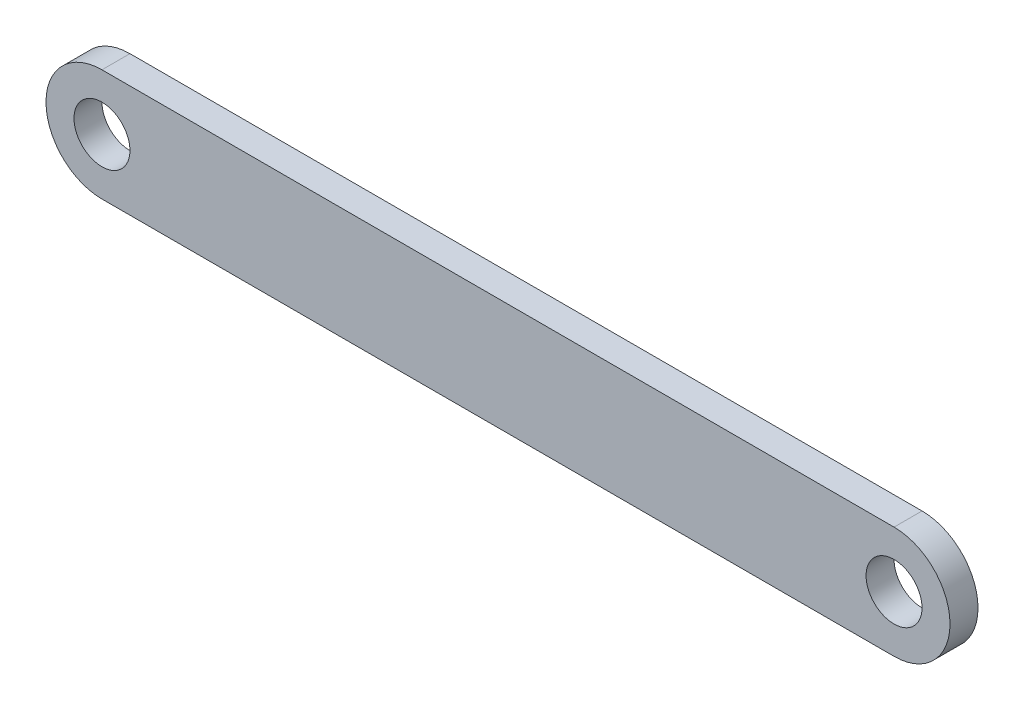
ISO-10303-21;
HEADER;
FILE_DESCRIPTION(('STEP AP214'),'2;1');
FILE_NAME('part.step','',(''),(''),'','','');
FILE_SCHEMA(('AUTOMOTIVE_DESIGN { 1 0 10303 214 1 1 1 1 }'));
ENDSEC;
DATA;
#1=APPLICATION_CONTEXT('core data for automotive mechanical design processes');
#2=APPLICATION_PROTOCOL_DEFINITION('international standard','automotive_design',2000,#1);
#3=PRODUCT_CONTEXT('',#1,'mechanical');
#4=PRODUCT('Part','Part','',(#3));
#5=PRODUCT_RELATED_PRODUCT_CATEGORY('part','',(#4));
#6=PRODUCT_DEFINITION_FORMATION('','',#4);
#7=PRODUCT_DEFINITION_CONTEXT('part definition',#1,'design');
#8=PRODUCT_DEFINITION('design','',#6,#7);
#9=PRODUCT_DEFINITION_SHAPE('','',#8);
#10=(LENGTH_UNIT() NAMED_UNIT(*) SI_UNIT(.MILLI.,.METRE.));
#11=(NAMED_UNIT(*) PLANE_ANGLE_UNIT() SI_UNIT($,.RADIAN.));
#12=(NAMED_UNIT(*) SI_UNIT($,.STERADIAN.) SOLID_ANGLE_UNIT());
#13=UNCERTAINTY_MEASURE_WITH_UNIT(LENGTH_MEASURE(1.E-05),#10,'distance_accuracy_value','');
#14=(GEOMETRIC_REPRESENTATION_CONTEXT(3) GLOBAL_UNCERTAINTY_ASSIGNED_CONTEXT((#13)) GLOBAL_UNIT_ASSIGNED_CONTEXT((#10,
#11,#12)) REPRESENTATION_CONTEXT('',''));
#15=CARTESIAN_POINT('',(0.,0.,0.));
#16=DIRECTION('',(0.,0.,1.));
#17=DIRECTION('',(1.,0.,0.));
#18=AXIS2_PLACEMENT_3D('',#15,#16,#17);
#19=CARTESIAN_POINT('',(0.,2.,1.));
#20=DIRECTION('',(0.,1.,0.));
#21=DIRECTION('',(-1.,0.,0.));
#22=AXIS2_PLACEMENT_3D('',#19,#20,#21);
#23=PLANE('',#22);
#24=DIRECTION('',(1.,0.,0.));
#25=VECTOR('',#24,1.);
#26=CARTESIAN_POINT('',(0.,2.,0.));
#27=LINE('',#26,#25);
#28=CARTESIAN_POINT('',(-28.3062,2.,0.));
#29=VERTEX_POINT('',#28);
#30=CARTESIAN_POINT('',(0.,2.,0.));
#31=VERTEX_POINT('',#30);
#32=EDGE_CURVE('E105',#29,#31,#27,.T.);
#33=ORIENTED_EDGE('',*,*,#32,.F.);
#34=DIRECTION('',(0.,0.,-1.));
#35=VECTOR('',#34,1.);
#36=CARTESIAN_POINT('',(-28.3062,2.,1.));
#37=LINE('',#36,#35);
#38=CARTESIAN_POINT('',(-28.3062,2.,1.));
#39=VERTEX_POINT('',#38);
#40=EDGE_CURVE('E11',#39,#29,#37,.T.);
#41=ORIENTED_EDGE('',*,*,#40,.F.);
#42=DIRECTION('',(1.,0.,0.));
#43=VECTOR('',#42,1.);
#44=CARTESIAN_POINT('',(0.,2.,1.));
#45=LINE('',#44,#43);
#46=CARTESIAN_POINT('',(0.,2.,1.));
#47=VERTEX_POINT('',#46);
#48=EDGE_CURVE('E87',#39,#47,#45,.T.);
#49=ORIENTED_EDGE('',*,*,#48,.T.);
#50=DIRECTION('',(0.,0.,-1.));
#51=VECTOR('',#50,1.);
#52=CARTESIAN_POINT('',(0.,2.,1.));
#53=LINE('',#52,#51);
#54=EDGE_CURVE('E75',#47,#31,#53,.T.);
#55=ORIENTED_EDGE('',*,*,#54,.T.);
#56=EDGE_LOOP('',(#33,#41,#49,#55));
#57=FACE_BOUND('',#56,.T.);
#58=ADVANCED_FACE('F36',(#57),#23,.T.);
#59=CARTESIAN_POINT('',(-28.3062,0.,1.));
#60=DIRECTION('',(0.,0.,-1.));
#61=DIRECTION('',(-1.,0.,0.));
#62=AXIS2_PLACEMENT_3D('',#59,#60,#61);
#63=CYLINDRICAL_SURFACE('',#62,2.);
#64=CARTESIAN_POINT('',(-28.3062,0.,0.));
#65=DIRECTION('',(0.,0.,1.));
#66=DIRECTION('',(1.,0.,0.));
#67=AXIS2_PLACEMENT_3D('',#64,#65,#66);
#68=CIRCLE('',#67,2.);
#69=CARTESIAN_POINT('',(-28.3062,-2.,0.));
#70=VERTEX_POINT('',#69);
#71=EDGE_CURVE('E92',#29,#70,#68,.T.);
#72=ORIENTED_EDGE('',*,*,#71,.T.);
#73=DIRECTION('',(0.,0.,-1.));
#74=VECTOR('',#73,1.);
#75=CARTESIAN_POINT('',(-28.3062,-2.,1.));
#76=LINE('',#75,#74);
#77=CARTESIAN_POINT('',(-28.3062,-2.,1.));
#78=VERTEX_POINT('',#77);
#79=EDGE_CURVE('E44',#78,#70,#76,.T.);
#80=ORIENTED_EDGE('',*,*,#79,.F.);
#81=CARTESIAN_POINT('',(-28.3062,0.,1.));
#82=DIRECTION('',(0.,0.,1.));
#83=DIRECTION('',(1.,0.,0.));
#84=AXIS2_PLACEMENT_3D('',#81,#82,#83);
#85=CIRCLE('',#84,2.);
#86=EDGE_CURVE('E81',#39,#78,#85,.T.);
#87=ORIENTED_EDGE('',*,*,#86,.F.);
#88=ORIENTED_EDGE('',*,*,#40,.T.);
#89=EDGE_LOOP('',(#72,#80,#87,#88));
#90=FACE_BOUND('',#89,.T.);
#91=ADVANCED_FACE('F90',(#90),#63,.T.);
#92=CARTESIAN_POINT('',(0.,-2.,1.));
#93=DIRECTION('',(0.,1.,0.));
#94=DIRECTION('',(-1.,0.,0.));
#95=AXIS2_PLACEMENT_3D('',#92,#93,#94);
#96=PLANE('',#95);
#97=DIRECTION('',(1.,0.,0.));
#98=VECTOR('',#97,1.);
#99=CARTESIAN_POINT('',(0.,-2.,0.));
#100=LINE('',#99,#98);
#101=CARTESIAN_POINT('',(0.,-2.,0.));
#102=VERTEX_POINT('',#101);
#103=EDGE_CURVE('E68',#70,#102,#100,.T.);
#104=ORIENTED_EDGE('',*,*,#103,.T.);
#105=DIRECTION('',(0.,0.,-1.));
#106=VECTOR('',#105,1.);
#107=CARTESIAN_POINT('',(0.,-2.,1.));
#108=LINE('',#107,#106);
#109=CARTESIAN_POINT('',(0.,-2.,1.));
#110=VERTEX_POINT('',#109);
#111=EDGE_CURVE('E93',#110,#102,#108,.T.);
#112=ORIENTED_EDGE('',*,*,#111,.F.);
#113=DIRECTION('',(1.,0.,0.));
#114=VECTOR('',#113,1.);
#115=CARTESIAN_POINT('',(0.,-2.,1.));
#116=LINE('',#115,#114);
#117=EDGE_CURVE('E86',#78,#110,#116,.T.);
#118=ORIENTED_EDGE('',*,*,#117,.F.);
#119=ORIENTED_EDGE('',*,*,#79,.T.);
#120=EDGE_LOOP('',(#104,#112,#118,#119));
#121=FACE_BOUND('',#120,.T.);
#122=ADVANCED_FACE('F94',(#121),#96,.F.);
#123=CARTESIAN_POINT('',(0.,0.,1.));
#124=DIRECTION('',(0.,0.,-1.));
#125=DIRECTION('',(-1.,0.,0.));
#126=AXIS2_PLACEMENT_3D('',#123,#124,#125);
#127=CYLINDRICAL_SURFACE('',#126,1.);
#128=CARTESIAN_POINT('',(0.,0.,1.));
#129=DIRECTION('',(0.,0.,1.));
#130=DIRECTION('',(1.,0.,0.));
#131=AXIS2_PLACEMENT_3D('',#128,#129,#130);
#132=CIRCLE('',#131,1.);
#133=CARTESIAN_POINT('',(1.,0.,1.));
#134=VERTEX_POINT('',#133);
#135=EDGE_CURVE('E96',#134,#134,#132,.T.);
#136=ORIENTED_EDGE('',*,*,#135,.T.);
#137=EDGE_LOOP('',(#136));
#138=FACE_BOUND('',#137,.T.);
#139=CARTESIAN_POINT('',(0.,0.,0.));
#140=DIRECTION('',(0.,0.,1.));
#141=DIRECTION('',(1.,0.,0.));
#142=AXIS2_PLACEMENT_3D('',#139,#140,#141);
#143=CIRCLE('',#142,1.);
#144=CARTESIAN_POINT('',(1.,0.,0.));
#145=VERTEX_POINT('',#144);
#146=EDGE_CURVE('E112',#145,#145,#143,.T.);
#147=ORIENTED_EDGE('',*,*,#146,.F.);
#148=EDGE_LOOP('',(#147));
#149=FACE_BOUND('',#148,.T.);
#150=ADVANCED_FACE('F132',(#138,#149),#127,.F.);
#151=CARTESIAN_POINT('',(0.,0.,1.));
#152=DIRECTION('',(0.,0.,-1.));
#153=DIRECTION('',(-1.,0.,0.));
#154=AXIS2_PLACEMENT_3D('',#151,#152,#153);
#155=CYLINDRICAL_SURFACE('',#154,2.);
#156=CARTESIAN_POINT('',(0.,0.,0.));
#157=DIRECTION('',(0.,0.,1.));
#158=DIRECTION('',(1.,0.,0.));
#159=AXIS2_PLACEMENT_3D('',#156,#157,#158);
#160=CIRCLE('',#159,2.);
#161=EDGE_CURVE('E110',#102,#31,#160,.T.);
#162=ORIENTED_EDGE('',*,*,#161,.T.);
#163=ORIENTED_EDGE('',*,*,#54,.F.);
#164=CARTESIAN_POINT('',(0.,0.,1.));
#165=DIRECTION('',(0.,0.,1.));
#166=DIRECTION('',(1.,0.,0.));
#167=AXIS2_PLACEMENT_3D('',#164,#165,#166);
#168=CIRCLE('',#167,2.);
#169=EDGE_CURVE('E52',#110,#47,#168,.T.);
#170=ORIENTED_EDGE('',*,*,#169,.F.);
#171=ORIENTED_EDGE('',*,*,#111,.T.);
#172=EDGE_LOOP('',(#162,#163,#170,#171));
#173=FACE_BOUND('',#172,.T.);
#174=ADVANCED_FACE('F121',(#173),#155,.T.);
#175=CARTESIAN_POINT('',(-28.3062,0.,1.));
#176=DIRECTION('',(0.,0.,-1.));
#177=DIRECTION('',(-1.,0.,0.));
#178=AXIS2_PLACEMENT_3D('',#175,#176,#177);
#179=CYLINDRICAL_SURFACE('',#178,1.);
#180=CARTESIAN_POINT('',(-28.3062,0.,1.));
#181=DIRECTION('',(0.,0.,1.));
#182=DIRECTION('',(1.,0.,0.));
#183=AXIS2_PLACEMENT_3D('',#180,#181,#182);
#184=CIRCLE('',#183,1.);
#185=CARTESIAN_POINT('',(-27.3062,0.,1.));
#186=VERTEX_POINT('',#185);
#187=EDGE_CURVE('E102',#186,#186,#184,.T.);
#188=ORIENTED_EDGE('',*,*,#187,.T.);
#189=EDGE_LOOP('',(#188));
#190=FACE_BOUND('',#189,.T.);
#191=CARTESIAN_POINT('',(-28.3062,0.,0.));
#192=DIRECTION('',(0.,0.,1.));
#193=DIRECTION('',(1.,0.,0.));
#194=AXIS2_PLACEMENT_3D('',#191,#192,#193);
#195=CIRCLE('',#194,1.);
#196=CARTESIAN_POINT('',(-27.3062,0.,0.));
#197=VERTEX_POINT('',#196);
#198=EDGE_CURVE('E115',#197,#197,#195,.T.);
#199=ORIENTED_EDGE('',*,*,#198,.F.);
#200=EDGE_LOOP('',(#199));
#201=FACE_BOUND('',#200,.T.);
#202=ADVANCED_FACE('F137',(#190,#201),#179,.F.);
#203=CARTESIAN_POINT('',(0.,0.,1.));
#204=DIRECTION('',(0.,0.,1.));
#205=DIRECTION('',(1.,0.,0.));
#206=AXIS2_PLACEMENT_3D('',#203,#204,#205);
#207=PLANE('',#206);
#208=ORIENTED_EDGE('',*,*,#48,.F.);
#209=ORIENTED_EDGE('',*,*,#86,.T.);
#210=ORIENTED_EDGE('',*,*,#117,.T.);
#211=ORIENTED_EDGE('',*,*,#169,.T.);
#212=EDGE_LOOP('',(#208,#209,#210,#211));
#213=FACE_BOUND('',#212,.T.);
#214=ORIENTED_EDGE('',*,*,#135,.F.);
#215=EDGE_LOOP('',(#214));
#216=FACE_BOUND('',#215,.T.);
#217=ORIENTED_EDGE('',*,*,#187,.F.);
#218=EDGE_LOOP('',(#217));
#219=FACE_BOUND('',#218,.T.);
#220=ADVANCED_FACE('F83',(#213,#216,#219),#207,.T.);
#221=CARTESIAN_POINT('',(0.,0.,0.));
#222=DIRECTION('',(0.,0.,1.));
#223=DIRECTION('',(1.,0.,0.));
#224=AXIS2_PLACEMENT_3D('',#221,#222,#223);
#225=PLANE('',#224);
#226=ORIENTED_EDGE('',*,*,#32,.T.);
#227=ORIENTED_EDGE('',*,*,#161,.F.);
#228=ORIENTED_EDGE('',*,*,#103,.F.);
#229=ORIENTED_EDGE('',*,*,#71,.F.);
#230=EDGE_LOOP('',(#226,#227,#228,#229));
#231=FACE_BOUND('',#230,.T.);
#232=ORIENTED_EDGE('',*,*,#146,.T.);
#233=EDGE_LOOP('',(#232));
#234=FACE_BOUND('',#233,.T.);
#235=ORIENTED_EDGE('',*,*,#198,.T.);
#236=EDGE_LOOP('',(#235));
#237=FACE_BOUND('',#236,.T.);
#238=ADVANCED_FACE('F123',(#231,#234,#237),#225,.F.);
#239=CLOSED_SHELL('',(#58,#91,#122,#150,#174,#202,#220,#238));
#240=MANIFOLD_SOLID_BREP('B2',#239);
#241=ADVANCED_BREP_SHAPE_REPRESENTATION('',(#18,#240),#14);
#242=SHAPE_DEFINITION_REPRESENTATION(#9,#241);
ENDSEC;
END-ISO-10303-21;
